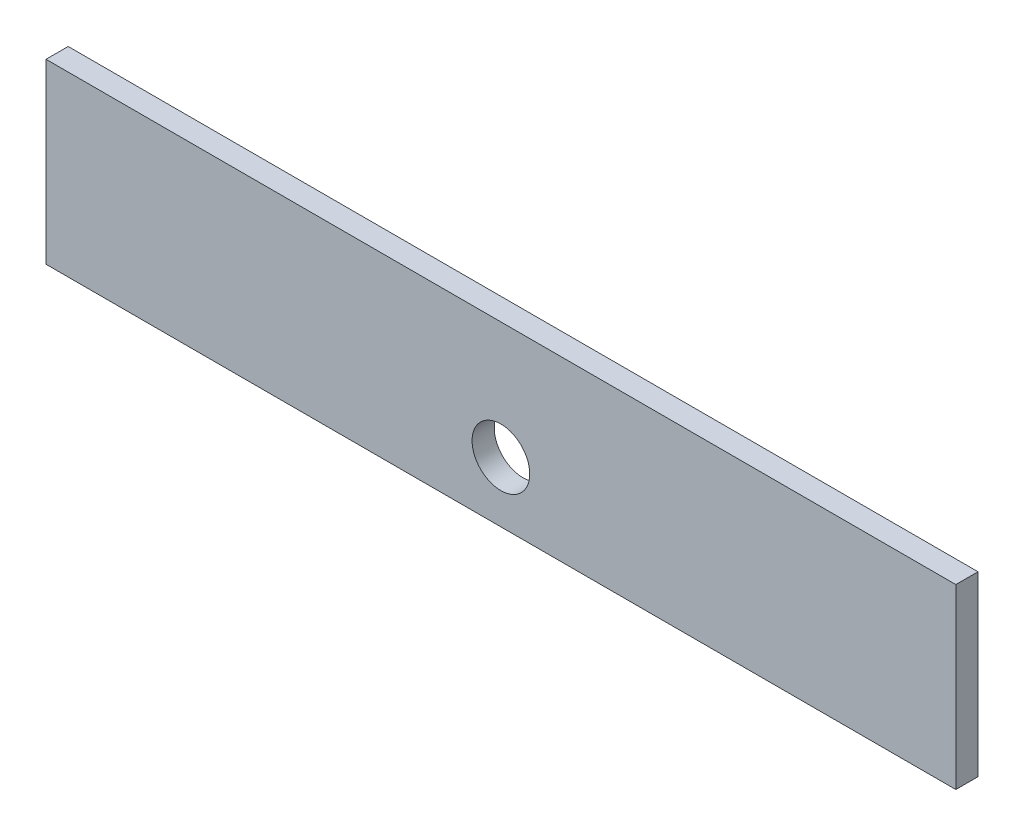
ISO-10303-21;
HEADER;
FILE_DESCRIPTION(('STEP AP214'),'2;1');
FILE_NAME('part.step','',(''),(''),'','','');
FILE_SCHEMA(('AUTOMOTIVE_DESIGN { 1 0 10303 214 1 1 1 1 }'));
ENDSEC;
DATA;
#1=APPLICATION_CONTEXT('core data for automotive mechanical design processes');
#2=APPLICATION_PROTOCOL_DEFINITION('international standard','automotive_design',2000,#1);
#3=PRODUCT_CONTEXT('',#1,'mechanical');
#4=PRODUCT('Part','Part','',(#3));
#5=PRODUCT_RELATED_PRODUCT_CATEGORY('part','',(#4));
#6=PRODUCT_DEFINITION_FORMATION('','',#4);
#7=PRODUCT_DEFINITION_CONTEXT('part definition',#1,'design');
#8=PRODUCT_DEFINITION('design','',#6,#7);
#9=PRODUCT_DEFINITION_SHAPE('','',#8);
#10=(LENGTH_UNIT() NAMED_UNIT(*) SI_UNIT(.MILLI.,.METRE.));
#11=(NAMED_UNIT(*) PLANE_ANGLE_UNIT() SI_UNIT($,.RADIAN.));
#12=(NAMED_UNIT(*) SI_UNIT($,.STERADIAN.) SOLID_ANGLE_UNIT());
#13=UNCERTAINTY_MEASURE_WITH_UNIT(LENGTH_MEASURE(1.E-05),#10,'distance_accuracy_value','');
#14=(GEOMETRIC_REPRESENTATION_CONTEXT(3) GLOBAL_UNCERTAINTY_ASSIGNED_CONTEXT((#13)) GLOBAL_UNIT_ASSIGNED_CONTEXT((#10,
#11,#12)) REPRESENTATION_CONTEXT('',''));
#15=CARTESIAN_POINT('',(0.,0.,0.));
#16=DIRECTION('',(0.,0.,1.));
#17=DIRECTION('',(1.,0.,0.));
#18=AXIS2_PLACEMENT_3D('',#15,#16,#17);
#19=CARTESIAN_POINT('',(0.,0.,10.));
#20=DIRECTION('',(0.,0.,1.));
#21=DIRECTION('',(1.,0.,0.));
#22=AXIS2_PLACEMENT_3D('',#19,#20,#21);
#23=PLANE('',#22);
#24=CARTESIAN_POINT('',(0.,-12.85289977723,10.));
#25=DIRECTION('',(0.,0.,1.));
#26=DIRECTION('',(1.,0.,0.));
#27=AXIS2_PLACEMENT_3D('',#24,#25,#26);
#28=CIRCLE('',#27,13.);
#29=CARTESIAN_POINT('',(13.,-12.85289977723,10.));
#30=VERTEX_POINT('',#29);
#31=EDGE_CURVE('E20',#30,#30,#28,.F.);
#32=ORIENTED_EDGE('',*,*,#31,.T.);
#33=EDGE_LOOP('',(#32));
#34=FACE_BOUND('',#33,.T.);
#35=DIRECTION('',(1.,0.,0.));
#36=VECTOR('',#35,1.);
#37=CARTESIAN_POINT('',(205.,40.,10.));
#38=LINE('',#37,#36);
#39=CARTESIAN_POINT('',(-205.,40.,10.));
#40=VERTEX_POINT('',#39);
#41=CARTESIAN_POINT('',(205.,40.,10.));
#42=VERTEX_POINT('',#41);
#43=EDGE_CURVE('E70',#40,#42,#38,.T.);
#44=ORIENTED_EDGE('',*,*,#43,.F.);
#45=DIRECTION('',(0.,1.,0.));
#46=VECTOR('',#45,1.);
#47=CARTESIAN_POINT('',(-205.,40.,10.));
#48=LINE('',#47,#46);
#49=CARTESIAN_POINT('',(-205.,-40.,10.));
#50=VERTEX_POINT('',#49);
#51=EDGE_CURVE('E67',#50,#40,#48,.T.);
#52=ORIENTED_EDGE('',*,*,#51,.F.);
#53=DIRECTION('',(1.,0.,0.));
#54=VECTOR('',#53,1.);
#55=CARTESIAN_POINT('',(-205.,-40.,10.));
#56=LINE('',#55,#54);
#57=CARTESIAN_POINT('',(205.,-40.,10.));
#58=VERTEX_POINT('',#57);
#59=EDGE_CURVE('E58',#58,#50,#56,.F.);
#60=ORIENTED_EDGE('',*,*,#59,.F.);
#61=DIRECTION('',(0.,1.,0.));
#62=VECTOR('',#61,1.);
#63=CARTESIAN_POINT('',(205.,-40.,10.));
#64=LINE('',#63,#62);
#65=EDGE_CURVE('E53',#42,#58,#64,.F.);
#66=ORIENTED_EDGE('',*,*,#65,.F.);
#67=EDGE_LOOP('',(#44,#52,#60,#66));
#68=FACE_BOUND('',#67,.T.);
#69=ADVANCED_FACE('F17',(#34,#68),#23,.T.);
#70=CARTESIAN_POINT('',(-205.,40.,0.));
#71=DIRECTION('',(-1.,0.,0.));
#72=DIRECTION('',(0.,0.,1.));
#73=AXIS2_PLACEMENT_3D('',#70,#71,#72);
#74=PLANE('',#73);
#75=DIRECTION('',(0.,0.,1.));
#76=VECTOR('',#75,1.);
#77=CARTESIAN_POINT('',(-205.,40.,0.));
#78=LINE('',#77,#76);
#79=CARTESIAN_POINT('',(-205.,40.,0.));
#80=VERTEX_POINT('',#79);
#81=EDGE_CURVE('E82',#80,#40,#78,.T.);
#82=ORIENTED_EDGE('',*,*,#81,.F.);
#83=DIRECTION('',(0.,1.,0.));
#84=VECTOR('',#83,1.);
#85=CARTESIAN_POINT('',(-205.,0.,0.));
#86=LINE('',#85,#84);
#87=CARTESIAN_POINT('',(-205.,-40.,0.));
#88=VERTEX_POINT('',#87);
#89=EDGE_CURVE('E77',#80,#88,#86,.F.);
#90=ORIENTED_EDGE('',*,*,#89,.T.);
#91=DIRECTION('',(0.,0.,-1.));
#92=VECTOR('',#91,1.);
#93=CARTESIAN_POINT('',(-205.,-40.,0.));
#94=LINE('',#93,#92);
#95=EDGE_CURVE('E63',#50,#88,#94,.T.);
#96=ORIENTED_EDGE('',*,*,#95,.F.);
#97=ORIENTED_EDGE('',*,*,#51,.T.);
#98=EDGE_LOOP('',(#82,#90,#96,#97));
#99=FACE_BOUND('',#98,.T.);
#100=ADVANCED_FACE('F76',(#99),#74,.T.);
#101=CARTESIAN_POINT('',(-205.,-40.,0.));
#102=DIRECTION('',(0.,-1.,0.));
#103=DIRECTION('',(0.,0.,-1.));
#104=AXIS2_PLACEMENT_3D('',#101,#102,#103);
#105=PLANE('',#104);
#106=ORIENTED_EDGE('',*,*,#95,.T.);
#107=DIRECTION('',(1.,0.,0.));
#108=VECTOR('',#107,1.);
#109=CARTESIAN_POINT('',(0.,-40.,0.));
#110=LINE('',#109,#108);
#111=CARTESIAN_POINT('',(205.,-40.,0.));
#112=VERTEX_POINT('',#111);
#113=EDGE_CURVE('E87',#88,#112,#110,.T.);
#114=ORIENTED_EDGE('',*,*,#113,.T.);
#115=DIRECTION('',(0.,0.,-1.));
#116=VECTOR('',#115,1.);
#117=CARTESIAN_POINT('',(205.,-40.,0.));
#118=LINE('',#117,#116);
#119=EDGE_CURVE('E65',#58,#112,#118,.T.);
#120=ORIENTED_EDGE('',*,*,#119,.F.);
#121=ORIENTED_EDGE('',*,*,#59,.T.);
#122=EDGE_LOOP('',(#106,#114,#120,#121));
#123=FACE_BOUND('',#122,.T.);
#124=ADVANCED_FACE('F60',(#123),#105,.T.);
#125=CARTESIAN_POINT('',(205.,-40.,0.));
#126=DIRECTION('',(1.,0.,0.));
#127=DIRECTION('',(0.,0.,-1.));
#128=AXIS2_PLACEMENT_3D('',#125,#126,#127);
#129=PLANE('',#128);
#130=ORIENTED_EDGE('',*,*,#119,.T.);
#131=DIRECTION('',(0.,1.,0.));
#132=VECTOR('',#131,1.);
#133=CARTESIAN_POINT('',(205.,0.,0.));
#134=LINE('',#133,#132);
#135=CARTESIAN_POINT('',(205.,40.,0.));
#136=VERTEX_POINT('',#135);
#137=EDGE_CURVE('E89',#112,#136,#134,.T.);
#138=ORIENTED_EDGE('',*,*,#137,.T.);
#139=DIRECTION('',(0.,0.,1.));
#140=VECTOR('',#139,1.);
#141=CARTESIAN_POINT('',(205.,40.,0.));
#142=LINE('',#141,#140);
#143=EDGE_CURVE('E34',#42,#136,#142,.F.);
#144=ORIENTED_EDGE('',*,*,#143,.F.);
#145=ORIENTED_EDGE('',*,*,#65,.T.);
#146=EDGE_LOOP('',(#130,#138,#144,#145));
#147=FACE_BOUND('',#146,.T.);
#148=ADVANCED_FACE('F96',(#147),#129,.T.);
#149=CARTESIAN_POINT('',(205.,40.,0.));
#150=DIRECTION('',(0.,1.,0.));
#151=DIRECTION('',(0.,0.,1.));
#152=AXIS2_PLACEMENT_3D('',#149,#150,#151);
#153=PLANE('',#152);
#154=ORIENTED_EDGE('',*,*,#143,.T.);
#155=DIRECTION('',(1.,0.,0.));
#156=VECTOR('',#155,1.);
#157=CARTESIAN_POINT('',(0.,40.,0.));
#158=LINE('',#157,#156);
#159=EDGE_CURVE('E26',#136,#80,#158,.F.);
#160=ORIENTED_EDGE('',*,*,#159,.T.);
#161=ORIENTED_EDGE('',*,*,#81,.T.);
#162=ORIENTED_EDGE('',*,*,#43,.T.);
#163=EDGE_LOOP('',(#154,#160,#161,#162));
#164=FACE_BOUND('',#163,.T.);
#165=ADVANCED_FACE('F92',(#164),#153,.T.);
#166=CARTESIAN_POINT('',(0.,-12.85289977723,0.));
#167=DIRECTION('',(0.,0.,1.));
#168=DIRECTION('',(1.,0.,0.));
#169=AXIS2_PLACEMENT_3D('',#166,#167,#168);
#170=CYLINDRICAL_SURFACE('',#169,13.);
#171=ORIENTED_EDGE('',*,*,#31,.F.);
#172=EDGE_LOOP('',(#171));
#173=FACE_BOUND('',#172,.T.);
#174=CARTESIAN_POINT('',(0.,-12.85289977723,0.));
#175=DIRECTION('',(0.,0.,1.));
#176=DIRECTION('',(1.,0.,0.));
#177=AXIS2_PLACEMENT_3D('',#174,#175,#176);
#178=CIRCLE('',#177,13.);
#179=CARTESIAN_POINT('',(13.,-12.85289977723,0.));
#180=VERTEX_POINT('',#179);
#181=EDGE_CURVE('E11',#180,#180,#178,.F.);
#182=ORIENTED_EDGE('',*,*,#181,.T.);
#183=EDGE_LOOP('',(#182));
#184=FACE_BOUND('',#183,.T.);
#185=ADVANCED_FACE('F104',(#173,#184),#170,.F.);
#186=CARTESIAN_POINT('',(0.,0.,0.));
#187=DIRECTION('',(0.,0.,1.));
#188=DIRECTION('',(1.,0.,0.));
#189=AXIS2_PLACEMENT_3D('',#186,#187,#188);
#190=PLANE('',#189);
#191=ORIENTED_EDGE('',*,*,#181,.F.);
#192=EDGE_LOOP('',(#191));
#193=FACE_BOUND('',#192,.T.);
#194=ORIENTED_EDGE('',*,*,#137,.F.);
#195=ORIENTED_EDGE('',*,*,#113,.F.);
#196=ORIENTED_EDGE('',*,*,#89,.F.);
#197=ORIENTED_EDGE('',*,*,#159,.F.);
#198=EDGE_LOOP('',(#194,#195,#196,#197));
#199=FACE_BOUND('',#198,.T.);
#200=ADVANCED_FACE('F95',(#193,#199),#190,.F.);
#201=CLOSED_SHELL('',(#69,#100,#124,#148,#165,#185,#200));
#202=MANIFOLD_SOLID_BREP('B1',#201);
#203=ADVANCED_BREP_SHAPE_REPRESENTATION('',(#18,#202),#14);
#204=SHAPE_DEFINITION_REPRESENTATION(#9,#203);
ENDSEC;
END-ISO-10303-21;
